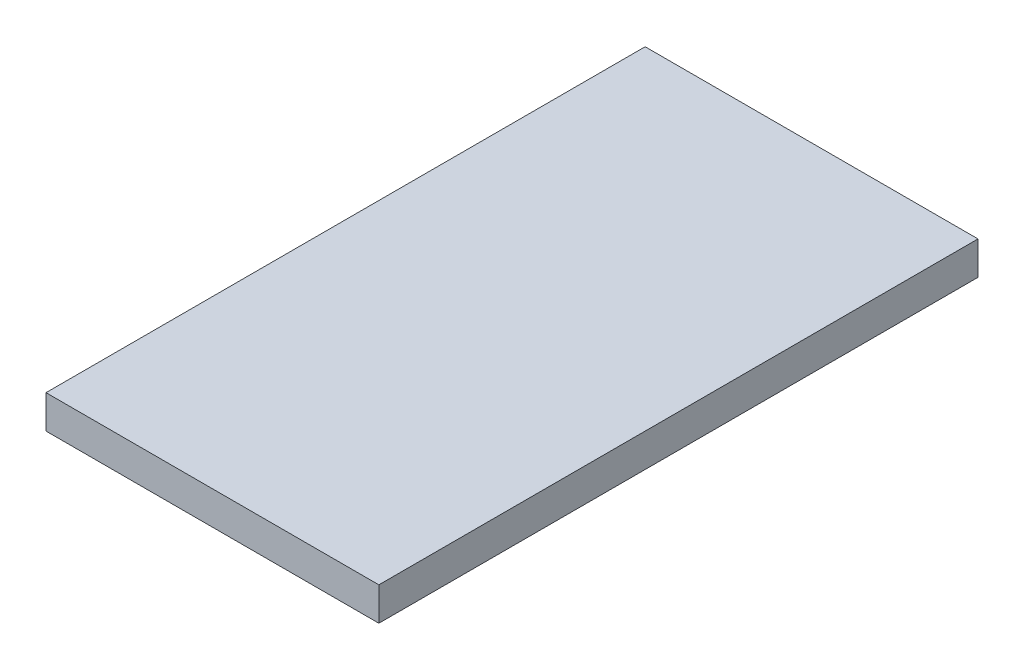
ISO-10303-21;
HEADER;
FILE_DESCRIPTION(('STEP AP214'),'2;1');
FILE_NAME('part.step','',(''),(''),'','','');
FILE_SCHEMA(('AUTOMOTIVE_DESIGN { 1 0 10303 214 1 1 1 1 }'));
ENDSEC;
DATA;
#1=APPLICATION_CONTEXT('core data for automotive mechanical design processes');
#2=APPLICATION_PROTOCOL_DEFINITION('international standard','automotive_design',2000,#1);
#3=PRODUCT_CONTEXT('',#1,'mechanical');
#4=PRODUCT('Part','Part','',(#3));
#5=PRODUCT_RELATED_PRODUCT_CATEGORY('part','',(#4));
#6=PRODUCT_DEFINITION_FORMATION('','',#4);
#7=PRODUCT_DEFINITION_CONTEXT('part definition',#1,'design');
#8=PRODUCT_DEFINITION('design','',#6,#7);
#9=PRODUCT_DEFINITION_SHAPE('','',#8);
#10=(LENGTH_UNIT() NAMED_UNIT(*) SI_UNIT(.MILLI.,.METRE.));
#11=(NAMED_UNIT(*) PLANE_ANGLE_UNIT() SI_UNIT($,.RADIAN.));
#12=(NAMED_UNIT(*) SI_UNIT($,.STERADIAN.) SOLID_ANGLE_UNIT());
#13=UNCERTAINTY_MEASURE_WITH_UNIT(LENGTH_MEASURE(1.E-05),#10,'distance_accuracy_value','');
#14=(GEOMETRIC_REPRESENTATION_CONTEXT(3) GLOBAL_UNCERTAINTY_ASSIGNED_CONTEXT((#13)) GLOBAL_UNIT_ASSIGNED_CONTEXT((#10,
#11,#12)) REPRESENTATION_CONTEXT('',''));
#15=CARTESIAN_POINT('',(0.,0.,0.));
#16=DIRECTION('',(0.,0.,1.));
#17=DIRECTION('',(1.,0.,0.));
#18=AXIS2_PLACEMENT_3D('',#15,#16,#17);
#19=CARTESIAN_POINT('',(50.,10.,90.));
#20=DIRECTION('',(-1.,0.,0.));
#21=DIRECTION('',(0.,0.,1.));
#22=AXIS2_PLACEMENT_3D('',#19,#20,#21);
#23=PLANE('',#22);
#24=DIRECTION('',(0.,0.,-1.));
#25=VECTOR('',#24,1.);
#26=CARTESIAN_POINT('',(50.,0.,90.));
#27=LINE('',#26,#25);
#28=CARTESIAN_POINT('',(50.,0.,90.));
#29=VERTEX_POINT('',#28);
#30=CARTESIAN_POINT('',(50.,0.,-90.));
#31=VERTEX_POINT('',#30);
#32=EDGE_CURVE('E111',#29,#31,#27,.T.);
#33=ORIENTED_EDGE('',*,*,#32,.T.);
#34=DIRECTION('',(0.,-1.,0.));
#35=VECTOR('',#34,1.);
#36=CARTESIAN_POINT('',(50.,10.,-90.));
#37=LINE('',#36,#35);
#38=CARTESIAN_POINT('',(50.,10.,-90.));
#39=VERTEX_POINT('',#38);
#40=EDGE_CURVE('E11',#39,#31,#37,.T.);
#41=ORIENTED_EDGE('',*,*,#40,.F.);
#42=DIRECTION('',(0.,0.,-1.));
#43=VECTOR('',#42,1.);
#44=CARTESIAN_POINT('',(50.,10.,90.));
#45=LINE('',#44,#43);
#46=CARTESIAN_POINT('',(50.,10.,90.));
#47=VERTEX_POINT('',#46);
#48=EDGE_CURVE('E95',#47,#39,#45,.T.);
#49=ORIENTED_EDGE('',*,*,#48,.F.);
#50=DIRECTION('',(0.,-1.,0.));
#51=VECTOR('',#50,1.);
#52=CARTESIAN_POINT('',(50.,10.,90.));
#53=LINE('',#52,#51);
#54=EDGE_CURVE('E107',#47,#29,#53,.T.);
#55=ORIENTED_EDGE('',*,*,#54,.T.);
#56=EDGE_LOOP('',(#33,#41,#49,#55));
#57=FACE_BOUND('',#56,.T.);
#58=ADVANCED_FACE('F43',(#57),#23,.F.);
#59=CARTESIAN_POINT('',(-50.,10.,-90.));
#60=DIRECTION('',(0.,0.,1.));
#61=DIRECTION('',(1.,0.,0.));
#62=AXIS2_PLACEMENT_3D('',#59,#60,#61);
#63=PLANE('',#62);
#64=DIRECTION('',(-1.,0.,0.));
#65=VECTOR('',#64,1.);
#66=CARTESIAN_POINT('',(-50.,0.,-90.));
#67=LINE('',#66,#65);
#68=CARTESIAN_POINT('',(-50.,0.,-90.));
#69=VERTEX_POINT('',#68);
#70=EDGE_CURVE('E100',#31,#69,#67,.T.);
#71=ORIENTED_EDGE('',*,*,#70,.T.);
#72=DIRECTION('',(0.,-1.,0.));
#73=VECTOR('',#72,1.);
#74=CARTESIAN_POINT('',(-50.,10.,-90.));
#75=LINE('',#74,#73);
#76=CARTESIAN_POINT('',(-50.,10.,-90.));
#77=VERTEX_POINT('',#76);
#78=EDGE_CURVE('E52',#77,#69,#75,.T.);
#79=ORIENTED_EDGE('',*,*,#78,.F.);
#80=DIRECTION('',(-1.,0.,0.));
#81=VECTOR('',#80,1.);
#82=CARTESIAN_POINT('',(-50.,10.,-90.));
#83=LINE('',#82,#81);
#84=EDGE_CURVE('E90',#39,#77,#83,.T.);
#85=ORIENTED_EDGE('',*,*,#84,.F.);
#86=ORIENTED_EDGE('',*,*,#40,.T.);
#87=EDGE_LOOP('',(#71,#79,#85,#86));
#88=FACE_BOUND('',#87,.T.);
#89=ADVANCED_FACE('F99',(#88),#63,.F.);
#90=CARTESIAN_POINT('',(-50.,10.,90.));
#91=DIRECTION('',(1.,0.,0.));
#92=DIRECTION('',(0.,0.,-1.));
#93=AXIS2_PLACEMENT_3D('',#90,#91,#92);
#94=PLANE('',#93);
#95=DIRECTION('',(0.,0.,1.));
#96=VECTOR('',#95,1.);
#97=CARTESIAN_POINT('',(-50.,0.,90.));
#98=LINE('',#97,#96);
#99=CARTESIAN_POINT('',(-50.,0.,90.));
#100=VERTEX_POINT('',#99);
#101=EDGE_CURVE('E77',#69,#100,#98,.T.);
#102=ORIENTED_EDGE('',*,*,#101,.T.);
#103=DIRECTION('',(0.,-1.,0.));
#104=VECTOR('',#103,1.);
#105=CARTESIAN_POINT('',(-50.,10.,90.));
#106=LINE('',#105,#104);
#107=CARTESIAN_POINT('',(-50.,10.,90.));
#108=VERTEX_POINT('',#107);
#109=EDGE_CURVE('E102',#108,#100,#106,.T.);
#110=ORIENTED_EDGE('',*,*,#109,.F.);
#111=DIRECTION('',(0.,0.,1.));
#112=VECTOR('',#111,1.);
#113=CARTESIAN_POINT('',(-50.,10.,90.));
#114=LINE('',#113,#112);
#115=EDGE_CURVE('E93',#77,#108,#114,.T.);
#116=ORIENTED_EDGE('',*,*,#115,.F.);
#117=ORIENTED_EDGE('',*,*,#78,.T.);
#118=EDGE_LOOP('',(#102,#110,#116,#117));
#119=FACE_BOUND('',#118,.T.);
#120=ADVANCED_FACE('F103',(#119),#94,.F.);
#121=CARTESIAN_POINT('',(-50.,10.,90.));
#122=DIRECTION('',(0.,0.,-1.));
#123=DIRECTION('',(-1.,0.,0.));
#124=AXIS2_PLACEMENT_3D('',#121,#122,#123);
#125=PLANE('',#124);
#126=DIRECTION('',(1.,0.,0.));
#127=VECTOR('',#126,1.);
#128=CARTESIAN_POINT('',(-50.,0.,90.));
#129=LINE('',#128,#127);
#130=EDGE_CURVE('E83',#100,#29,#129,.T.);
#131=ORIENTED_EDGE('',*,*,#130,.T.);
#132=ORIENTED_EDGE('',*,*,#54,.F.);
#133=DIRECTION('',(1.,0.,0.));
#134=VECTOR('',#133,1.);
#135=CARTESIAN_POINT('',(-50.,10.,90.));
#136=LINE('',#135,#134);
#137=EDGE_CURVE('E60',#108,#47,#136,.T.);
#138=ORIENTED_EDGE('',*,*,#137,.F.);
#139=ORIENTED_EDGE('',*,*,#109,.T.);
#140=EDGE_LOOP('',(#131,#132,#138,#139));
#141=FACE_BOUND('',#140,.T.);
#142=ADVANCED_FACE('F124',(#141),#125,.F.);
#143=CARTESIAN_POINT('',(0.,10.,0.));
#144=DIRECTION('',(0.,-1.,0.));
#145=DIRECTION('',(0.,0.,-1.));
#146=AXIS2_PLACEMENT_3D('',#143,#144,#145);
#147=PLANE('',#146);
#148=ORIENTED_EDGE('',*,*,#48,.T.);
#149=ORIENTED_EDGE('',*,*,#84,.T.);
#150=ORIENTED_EDGE('',*,*,#115,.T.);
#151=ORIENTED_EDGE('',*,*,#137,.T.);
#152=EDGE_LOOP('',(#148,#149,#150,#151));
#153=FACE_BOUND('',#152,.T.);
#154=ADVANCED_FACE('F91',(#153),#147,.F.);
#155=CARTESIAN_POINT('',(0.,0.,0.));
#156=DIRECTION('',(0.,-1.,0.));
#157=DIRECTION('',(0.,0.,-1.));
#158=AXIS2_PLACEMENT_3D('',#155,#156,#157);
#159=PLANE('',#158);
#160=ORIENTED_EDGE('',*,*,#32,.F.);
#161=ORIENTED_EDGE('',*,*,#130,.F.);
#162=ORIENTED_EDGE('',*,*,#101,.F.);
#163=ORIENTED_EDGE('',*,*,#70,.F.);
#164=EDGE_LOOP('',(#160,#161,#162,#163));
#165=FACE_BOUND('',#164,.T.);
#166=ADVANCED_FACE('F127',(#165),#159,.T.);
#167=CLOSED_SHELL('',(#58,#89,#120,#142,#154,#166));
#168=MANIFOLD_SOLID_BREP('B2',#167);
#169=ADVANCED_BREP_SHAPE_REPRESENTATION('',(#18,#168),#14);
#170=SHAPE_DEFINITION_REPRESENTATION(#9,#169);
ENDSEC;
END-ISO-10303-21;
